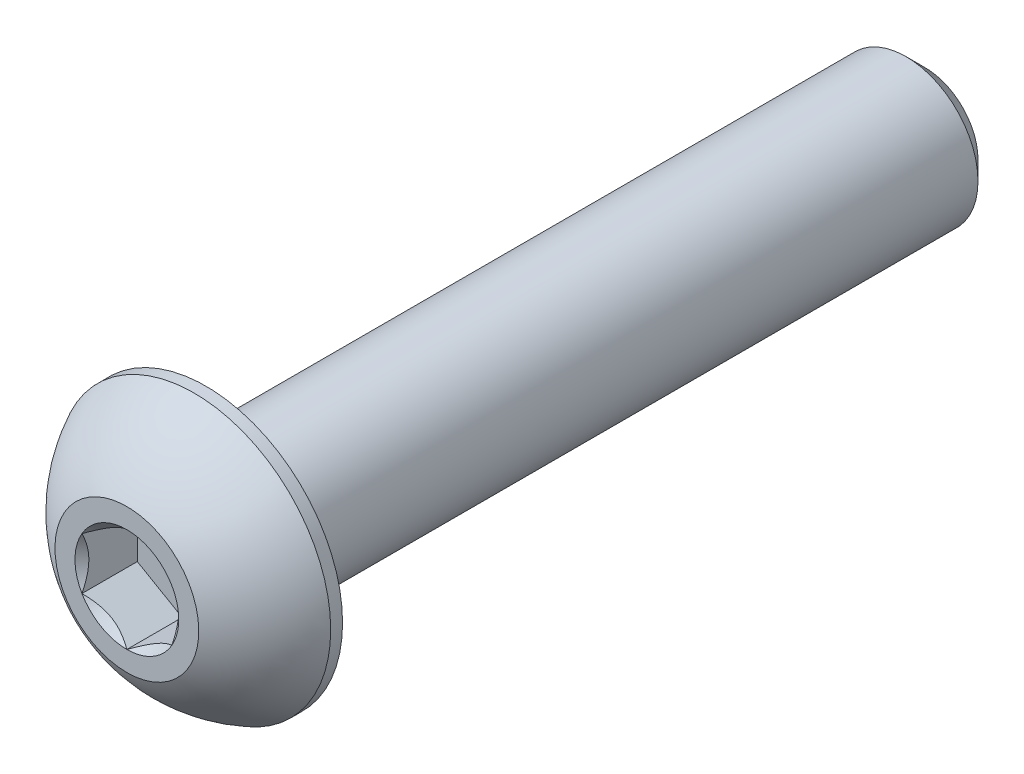
ISO-10303-21;
HEADER;
FILE_DESCRIPTION(('STEP AP214'),'2;1');
FILE_NAME('part.step','',(''),(''),'','','');
FILE_SCHEMA(('AUTOMOTIVE_DESIGN { 1 0 10303 214 1 1 1 1 }'));
ENDSEC;
DATA;
#1=APPLICATION_CONTEXT('core data for automotive mechanical design processes');
#2=APPLICATION_PROTOCOL_DEFINITION('international standard','automotive_design',2000,#1);
#3=PRODUCT_CONTEXT('',#1,'mechanical');
#4=PRODUCT('Part','Part','',(#3));
#5=PRODUCT_RELATED_PRODUCT_CATEGORY('part','',(#4));
#6=PRODUCT_DEFINITION_FORMATION('','',#4);
#7=PRODUCT_DEFINITION_CONTEXT('part definition',#1,'design');
#8=PRODUCT_DEFINITION('design','',#6,#7);
#9=PRODUCT_DEFINITION_SHAPE('','',#8);
#10=(LENGTH_UNIT() NAMED_UNIT(*) SI_UNIT(.MILLI.,.METRE.));
#11=(NAMED_UNIT(*) PLANE_ANGLE_UNIT() SI_UNIT($,.RADIAN.));
#12=(NAMED_UNIT(*) SI_UNIT($,.STERADIAN.) SOLID_ANGLE_UNIT());
#13=UNCERTAINTY_MEASURE_WITH_UNIT(LENGTH_MEASURE(1.E-05),#10,'distance_accuracy_value','');
#14=(GEOMETRIC_REPRESENTATION_CONTEXT(3) GLOBAL_UNCERTAINTY_ASSIGNED_CONTEXT((#13)) GLOBAL_UNIT_ASSIGNED_CONTEXT((#10,
#11,#12)) REPRESENTATION_CONTEXT('',''));
#15=CARTESIAN_POINT('',(0.,0.,0.));
#16=DIRECTION('',(0.,0.,1.));
#17=DIRECTION('',(1.,0.,0.));
#18=AXIS2_PLACEMENT_3D('',#15,#16,#17);
#19=CARTESIAN_POINT('',(0.,0.,-22.2));
#20=DIRECTION('',(0.,0.,1.));
#21=DIRECTION('',(1.,0.,0.));
#22=AXIS2_PLACEMENT_3D('',#19,#20,#21);
#23=PLANE('',#22);
#24=CARTESIAN_POINT('',(0.,0.,-22.2));
#25=DIRECTION('',(0.,0.,1.));
#26=DIRECTION('',(1.,0.,0.));
#27=AXIS2_PLACEMENT_3D('',#24,#25,#26);
#28=CIRCLE('',#27,1.47500000000003);
#29=CARTESIAN_POINT('',(1.47500000000003,0.,-22.2));
#30=VERTEX_POINT('',#29);
#31=EDGE_CURVE('E55',#30,#30,#28,.T.);
#32=ORIENTED_EDGE('',*,*,#31,.F.);
#33=EDGE_LOOP('',(#32));
#34=FACE_BOUND('',#33,.T.);
#35=ADVANCED_FACE('F41',(#34),#23,.F.);
#36=CARTESIAN_POINT('',(0.,0.,-22.2));
#37=DIRECTION('',(0.,0.,1.));
#38=DIRECTION('',(1.,0.,0.));
#39=AXIS2_PLACEMENT_3D('',#36,#37,#38);
#40=CONICAL_SURFACE('',#39,1.47500000000003,0.785398163397436);
#41=CARTESIAN_POINT('',(0.,0.,-21.675));
#42=DIRECTION('',(0.,0.,1.));
#43=DIRECTION('',(1.,0.,0.));
#44=AXIS2_PLACEMENT_3D('',#41,#42,#43);
#45=CIRCLE('',#44,2.00000000000001);
#46=CARTESIAN_POINT('',(2.00000000000001,0.,-21.675));
#47=VERTEX_POINT('',#46);
#48=EDGE_CURVE('E198',#47,#47,#45,.T.);
#49=ORIENTED_EDGE('',*,*,#48,.F.);
#50=EDGE_LOOP('',(#49));
#51=FACE_BOUND('',#50,.T.);
#52=ORIENTED_EDGE('',*,*,#31,.T.);
#53=EDGE_LOOP('',(#52));
#54=FACE_BOUND('',#53,.T.);
#55=ADVANCED_FACE('F205',(#51,#54),#40,.T.);
#56=CARTESIAN_POINT('',(0.,0.,0.));
#57=DIRECTION('',(0.,0.,1.));
#58=DIRECTION('',(1.,0.,0.));
#59=AXIS2_PLACEMENT_3D('',#56,#57,#58);
#60=CYLINDRICAL_SURFACE('',#59,2.00000000000001);
#61=CARTESIAN_POINT('',(0.,0.,-2.2));
#62=DIRECTION('',(0.,0.,1.));
#63=DIRECTION('',(1.,0.,0.));
#64=AXIS2_PLACEMENT_3D('',#61,#62,#63);
#65=CIRCLE('',#64,2.00000000000001);
#66=CARTESIAN_POINT('',(2.00000000000001,0.,-2.2));
#67=VERTEX_POINT('',#66);
#68=EDGE_CURVE('E194',#67,#67,#65,.T.);
#69=ORIENTED_EDGE('',*,*,#68,.F.);
#70=EDGE_LOOP('',(#69));
#71=FACE_BOUND('',#70,.T.);
#72=ORIENTED_EDGE('',*,*,#48,.T.);
#73=EDGE_LOOP('',(#72));
#74=FACE_BOUND('',#73,.T.);
#75=ADVANCED_FACE('F211',(#71,#74),#60,.T.);
#76=CARTESIAN_POINT('',(0.,-3.8,-2.2));
#77=DIRECTION('',(0.,0.,1.));
#78=DIRECTION('',(1.,0.,0.));
#79=AXIS2_PLACEMENT_3D('',#76,#77,#78);
#80=PLANE('',#79);
#81=CARTESIAN_POINT('',(0.,0.,-2.2));
#82=DIRECTION('',(0.,0.,1.));
#83=DIRECTION('',(1.,0.,0.));
#84=AXIS2_PLACEMENT_3D('',#81,#82,#83);
#85=CIRCLE('',#84,3.8);
#86=CARTESIAN_POINT('',(3.8,0.,-2.2));
#87=VERTEX_POINT('',#86);
#88=EDGE_CURVE('E186',#87,#87,#85,.T.);
#89=ORIENTED_EDGE('',*,*,#88,.F.);
#90=EDGE_LOOP('',(#89));
#91=FACE_BOUND('',#90,.T.);
#92=ORIENTED_EDGE('',*,*,#68,.T.);
#93=EDGE_LOOP('',(#92));
#94=FACE_BOUND('',#93,.T.);
#95=ADVANCED_FACE('F216',(#91,#94),#80,.F.);
#96=CARTESIAN_POINT('',(0.,0.,-3.72644385026738));
#97=DIRECTION('',(0.,0.,1.));
#98=DIRECTION('',(0.,-1.,0.));
#99=AXIS2_PLACEMENT_3D('',#96,#97,#98);
#100=SPHERICAL_SURFACE('',#99,4.22922968981299);
#101=CARTESIAN_POINT('',(0.,0.,0.));
#102=DIRECTION('',(0.,0.,1.));
#103=DIRECTION('',(1.,0.,0.));
#104=AXIS2_PLACEMENT_3D('',#101,#102,#103);
#105=CIRCLE('',#104,2.00000000000001);
#106=CARTESIAN_POINT('',(0.,-2.00000000000001,0.));
#107=VERTEX_POINT('',#106);
#108=EDGE_CURVE('E190',#107,#107,#105,.T.);
#109=CARTESIAN_POINT('',(0.,0.,-1.87));
#110=DIRECTION('',(0.,0.,1.));
#111=DIRECTION('',(1.,0.,0.));
#112=AXIS2_PLACEMENT_3D('',#109,#110,#111);
#113=CIRCLE('',#112,3.8);
#114=CARTESIAN_POINT('',(0.,-3.8,-1.87));
#115=VERTEX_POINT('',#114);
#116=EDGE_CURVE('E182',#115,#115,#113,.T.);
#117=CARTESIAN_POINT('',(0.,-2.00000000000001,0.));
#118=CARTESIAN_POINT('',(0.,-2.02421343985615,-0.0129954259644869));
#119=CARTESIAN_POINT('',(0.,-2.04830018323976,-0.0262269129651298));
#120=CARTESIAN_POINT('',(0.,-2.09621120342127,-0.0531568415057489));
#121=CARTESIAN_POINT('',(0.,-2.12003548021918,-0.0668552830457251));
#122=CARTESIAN_POINT('',(0.,-2.16741249358868,-0.0947139531320313));
#123=CARTESIAN_POINT('',(0.,-2.19096523016027,-0.108874181678362));
#124=CARTESIAN_POINT('',(0.,-2.23779021933684,-0.137651035235957));
#125=CARTESIAN_POINT('',(0.,-2.26106247194182,-0.152267660247222));
#126=CARTESIAN_POINT('',(0.,-2.30731764886073,-0.181951755514141));
#127=CARTESIAN_POINT('',(0.,-2.33030057317466,-0.197019225769796));
#128=CARTESIAN_POINT('',(0.,-2.37596836104236,-0.227599285582871));
#129=CARTESIAN_POINT('',(0.,-2.39865322459613,-0.243111875140292));
#130=CARTESIAN_POINT('',(0.,-2.44371627121514,-0.274576279395883));
#131=CARTESIAN_POINT('',(0.,-2.46609445428039,-0.290528094094054));
#132=CARTESIAN_POINT('',(0.,-2.51053563686182,-0.322864887331673));
#133=CARTESIAN_POINT('',(0.,-2.53259863637801,-0.339249865871121));
#134=CARTESIAN_POINT('',(0.,-2.57640106852493,-0.372446760967232));
#135=CARTESIAN_POINT('',(0.,-2.59814050115565,-0.389258677523893));
#136=CARTESIAN_POINT('',(0.,-2.64128753915154,-0.423303060588149));
#137=CARTESIAN_POINT('',(0.,-2.66269514451672,-0.440535527095743));
#138=CARTESIAN_POINT('',(0.,-2.70517039368396,-0.475414462202968));
#139=CARTESIAN_POINT('',(0.,-2.72623803748603,-0.493060930802598));
#140=CARTESIAN_POINT('',(0.,-2.76802535840619,-0.52876116492441));
#141=CARTESIAN_POINT('',(0.,-2.78874503552429,-0.546814930446591));
#142=CARTESIAN_POINT('',(0.,-2.82982855017314,-0.583322898482808));
#143=CARTESIAN_POINT('',(0.,-2.8501923877039,-0.601777100996845));
#144=CARTESIAN_POINT('',(0.,-2.89055648548395,-0.639078930931024));
#145=CARTESIAN_POINT('',(0.,-2.91055674573325,-0.657926558351167));
#146=CARTESIAN_POINT('',(0.,-2.95018608940553,-0.696008076521268));
#147=CARTESIAN_POINT('',(0.,-2.96981517282853,-0.715241967271226));
#148=CARTESIAN_POINT('',(0.,-3.00869470434028,-0.754088703755296));
#149=CARTESIAN_POINT('',(0.,-3.02794515242904,-0.773701549489407));
#150=CARTESIAN_POINT('',(0.,-3.06606009863533,-0.813298743603727));
#151=CARTESIAN_POINT('',(0.,-3.08492459675287,-0.833283091983936));
#152=CARTESIAN_POINT('',(0.,-3.12226047503003,-0.873615697891679));
#153=CARTESIAN_POINT('',(0.,-3.14073185518965,-0.893963955419214));
#154=CARTESIAN_POINT('',(0.,-3.17727447893822,-0.935016647847444));
#155=CARTESIAN_POINT('',(0.,-3.19534572252716,-0.95572108274814));
#156=CARTESIAN_POINT('',(0.,-3.23108120656243,-0.99747826281099));
#157=CARTESIAN_POINT('',(0.,-3.24874544700875,-1.01853100797314));
#158=CARTESIAN_POINT('',(0.,-3.28366021283673,-1.06097680909897));
#159=CARTESIAN_POINT('',(0.,-3.30091073821839,-1.08236986506264));
#160=CARTESIAN_POINT('',(0.,-3.33499151919534,-1.12548815902284));
#161=CARTESIAN_POINT('',(0.,-3.35182177479064,-1.14721339701936));
#162=CARTESIAN_POINT('',(0.,-3.38505562116372,-1.1909878000568));
#163=CARTESIAN_POINT('',(0.,-3.40145921194149,-1.21303696509771));
#164=CARTESIAN_POINT('',(0.,-3.43383349577047,-1.25745084415152));
#165=CARTESIAN_POINT('',(0.,-3.44980418882167,-1.27981555816441));
#166=CARTESIAN_POINT('',(0.,-3.48130660877275,-1.32485203719233));
#167=CARTESIAN_POINT('',(0.,-3.49683833567264,-1.34752380220736));
#168=CARTESIAN_POINT('',(0.,-3.52745692170932,-1.39316576858967));
#169=CARTESIAN_POINT('',(0.,-3.5425437808461,-1.41613596995695));
#170=CARTESIAN_POINT('',(0.,-3.57226689871518,-1.46236608103065));
#171=CARTESIAN_POINT('',(0.,-3.58690315744748,-1.48562599073709));
#172=CARTESIAN_POINT('',(0.,-3.615719513332,-1.5324266802666));
#173=CARTESIAN_POINT('',(0.,-3.62989961048422,-1.55596746008967));
#174=CARTESIAN_POINT('',(0.,-3.65779825442823,-1.6033209453859));
#175=CARTESIAN_POINT('',(0.,-3.67151680122002,-1.62713365085906));
#176=CARTESIAN_POINT('',(0.,-3.69848713452322,-1.67502193787766));
#177=CARTESIAN_POINT('',(0.,-3.71173892103461,-1.6990975194231));
#178=CARTESIAN_POINT('',(0.,-3.73777068821038,-1.74750241579215));
#179=CARTESIAN_POINT('',(0.,-3.75055066887474,-1.77183173061575));
#180=CARTESIAN_POINT('',(0.,-3.77563400658953,-1.82073482944519));
#181=CARTESIAN_POINT('',(0.,-3.78793736363997,-1.84530861345103));
#182=CARTESIAN_POINT('',(0.,-3.8,-1.87));
#183=B_SPLINE_CURVE_WITH_KNOTS('',3,(#117,#118,#119,#120,#121,#122,#123,#124,#125,#126,#127,
#128,#129,#130,#131,#132,#133,#134,#135,#136,#137,#138,#139,#140,#141,#142,#143,#144,#145,#146,
#147,#148,#149,#150,#151,#152,#153,#154,#155,#156,#157,#158,#159,#160,#161,#162,#163,#164,#165,
#166,#167,#168,#169,#170,#171,#172,#173,#174,#175,#176,#177,#178,#179,#180,#181,#182),
.UNSPECIFIED.,.F.,.F.,(4,2,2,2,2,2,2,2,2,2,2,2,2,2,2,2,2,2,2,2,2,2,2,2,2,2,2,2,2,2,2,2,4),(0.,
0.0824398589102638,0.164879717820528,0.247319576730792,0.329759435641056,0.41219929455132,
0.494639153461583,0.577079012371847,0.659518871282112,0.741958730192376,0.82439858910264,
0.906838448012904,0.989278306923168,1.07171816583343,1.1541580247437,1.23659788365396,
1.31903774256422,1.40147760147449,1.48391746038475,1.56635731929502,1.64879717820528,
1.73123703711554,1.81367689602581,1.89611675493607,1.97855661384634,2.0609964727566,
2.14343633166686,2.22587619057713,2.30831604948739,2.39075590839766,2.47319576730792,
2.55563562621818,2.63807548512845),.UNSPECIFIED.);
#184=EDGE_CURVE('BSEAM221',#107,#115,#183,.T.);
#185=ORIENTED_EDGE('',*,*,#108,.F.);
#186=ORIENTED_EDGE('',*,*,#116,.T.);
#187=ORIENTED_EDGE('',*,*,#184,.T.);
#188=ORIENTED_EDGE('',*,*,#184,.F.);
#189=EDGE_LOOP('',(#185,#187,#186,#188));
#190=FACE_BOUND('',#189,.T.);
#191=ADVANCED_FACE('F221',(#190),#100,.T.);
#192=CARTESIAN_POINT('',(0.,-2.00000000000001,0.));
#193=DIRECTION('',(0.,0.,-1.));
#194=DIRECTION('',(-1.,0.,0.));
#195=AXIS2_PLACEMENT_3D('',#192,#193,#194);
#196=PLANE('',#195);
#197=CARTESIAN_POINT('',(0.,0.,0.));
#198=DIRECTION('',(0.,0.,1.));
#199=DIRECTION('',(1.,0.,0.));
#200=AXIS2_PLACEMENT_3D('',#197,#198,#199);
#201=CIRCLE('',#200,1.44337567297406);
#202=CARTESIAN_POINT('',(-1.25,0.721687836487031,0.));
#203=VERTEX_POINT('',#202);
#204=CARTESIAN_POINT('',(-1.25,-0.721687836487033,0.));
#205=VERTEX_POINT('',#204);
#206=EDGE_CURVE('E68',#203,#205,#201,.T.);
#207=ORIENTED_EDGE('',*,*,#206,.F.);
#208=CARTESIAN_POINT('',(0.,1.44337567297406,0.));
#209=VERTEX_POINT('',#208);
#210=EDGE_CURVE('E145',#209,#203,#201,.T.);
#211=ORIENTED_EDGE('',*,*,#210,.F.);
#212=CARTESIAN_POINT('',(1.25,0.721687836487029,0.));
#213=VERTEX_POINT('',#212);
#214=EDGE_CURVE('E140',#213,#209,#201,.T.);
#215=ORIENTED_EDGE('',*,*,#214,.F.);
#216=CARTESIAN_POINT('',(1.25,-0.721687836487029,0.));
#217=VERTEX_POINT('',#216);
#218=EDGE_CURVE('E109',#217,#213,#201,.T.);
#219=ORIENTED_EDGE('',*,*,#218,.F.);
#220=CARTESIAN_POINT('',(0.,-1.44337567297406,0.));
#221=VERTEX_POINT('',#220);
#222=EDGE_CURVE('E100',#221,#217,#201,.T.);
#223=ORIENTED_EDGE('',*,*,#222,.F.);
#224=EDGE_CURVE('E61',#205,#221,#201,.T.);
#225=ORIENTED_EDGE('',*,*,#224,.F.);
#226=EDGE_LOOP('',(#207,#211,#215,#219,#223,#225));
#227=FACE_BOUND('',#226,.T.);
#228=ORIENTED_EDGE('',*,*,#108,.T.);
#229=EDGE_LOOP('',(#228));
#230=FACE_BOUND('',#229,.T.);
#231=ADVANCED_FACE('F137',(#227,#230),#196,.F.);
#232=CARTESIAN_POINT('',(0.,0.,0.));
#233=DIRECTION('',(0.,0.,1.));
#234=DIRECTION('',(1.,0.,0.));
#235=AXIS2_PLACEMENT_3D('',#232,#233,#234);
#236=CYLINDRICAL_SURFACE('',#235,3.8);
#237=ORIENTED_EDGE('',*,*,#116,.F.);
#238=EDGE_LOOP('',(#237));
#239=FACE_BOUND('',#238,.T.);
#240=ORIENTED_EDGE('',*,*,#88,.T.);
#241=EDGE_LOOP('',(#240));
#242=FACE_BOUND('',#241,.T.);
#243=ADVANCED_FACE('F227',(#239,#242),#236,.T.);
#244=CARTESIAN_POINT('',(0.,0.,0.));
#245=DIRECTION('',(0.,0.,1.));
#246=DIRECTION('',(1.,0.,0.));
#247=AXIS2_PLACEMENT_3D('',#244,#245,#246);
#248=CONICAL_SURFACE('',#247,1.44337567297406,0.78539816339745);
#249=ORIENTED_EDGE('',*,*,#218,.T.);
#250=CARTESIAN_POINT('',(1.25,-1.43934010808076,0.462982096892323));
#251=CARTESIAN_POINT('',(1.25,-1.40429313005658,0.436524922632886));
#252=CARTESIAN_POINT('',(1.25,-1.36905087135598,0.410327160354276));
#253=CARTESIAN_POINT('',(1.25,-1.2980965070631,0.358557571839581));
#254=CARTESIAN_POINT('',(1.25,-1.26238428576495,0.332985904356291));
#255=CARTESIAN_POINT('',(1.25,-1.15390111792707,0.257005993689462));
#256=CARTESIAN_POINT('',(1.25,-1.08031646726264,0.207740286189565));
#257=CARTESIAN_POINT('',(1.25,-0.926012322755091,0.111025830263131));
#258=CARTESIAN_POINT('',(1.25,-0.845125318656143,0.0638412989417957));
#259=CARTESIAN_POINT('',(1.25,-0.679311174076599,-0.0224692656095865));
#260=CARTESIAN_POINT('',(1.25,-0.594398891026685,-0.0616224653730992));
#261=CARTESIAN_POINT('',(1.25,-0.466944812460738,-0.109522776311707));
#262=CARTESIAN_POINT('',(1.25,-0.426289985812819,-0.123270510213663));
#263=CARTESIAN_POINT('',(1.25,-0.343998850091265,-0.147502072549456));
#264=CARTESIAN_POINT('',(1.25,-0.30236247361496,-0.157985676130227));
#265=CARTESIAN_POINT('',(1.25,-0.219052696285663,-0.174969838251702));
#266=CARTESIAN_POINT('',(1.25,-0.177393428474498,-0.18153863952863));
#267=CARTESIAN_POINT('',(1.25,-0.0936293693401902,-0.190564946542239));
#268=CARTESIAN_POINT('',(1.25,-0.0515246558543941,-0.193023159002731));
#269=CARTESIAN_POINT('',(1.25,0.0311890576306333,-0.193645937986714));
#270=CARTESIAN_POINT('',(1.25,0.071796962549932,-0.191962883153752));
#271=CARTESIAN_POINT('',(1.25,0.152668636885198,-0.184731729402085));
#272=CARTESIAN_POINT('',(1.25,0.192932338835359,-0.179182889586891));
#273=CARTESIAN_POINT('',(1.25,0.273499879165296,-0.164428963535045));
#274=CARTESIAN_POINT('',(1.25,0.313792180618512,-0.155161824035893));
#275=CARTESIAN_POINT('',(1.25,0.393496413911458,-0.133463821542651));
#276=CARTESIAN_POINT('',(1.25,0.43290841911506,-0.121033223269353));
#277=CARTESIAN_POINT('',(1.25,0.556992735862299,-0.0772206470685609));
#278=CARTESIAN_POINT('',(1.25,0.639898924666086,-0.0408489271240422));
#279=CARTESIAN_POINT('',(1.25,0.801816555499702,0.0400191621783368));
#280=CARTESIAN_POINT('',(1.25,0.880812666325045,0.084544720911988));
#281=CARTESIAN_POINT('',(1.25,1.0317856127975,0.176404876666627));
#282=CARTESIAN_POINT('',(1.25,1.10391618485086,0.223489933916251));
#283=CARTESIAN_POINT('',(1.25,1.21018606043311,0.29627856159854));
#284=CARTESIAN_POINT('',(1.25,1.24515069969379,0.32079808539336));
#285=CARTESIAN_POINT('',(1.25,1.31460220852737,0.370485636765682));
#286=CARTESIAN_POINT('',(1.25,1.34908920596618,0.395653485415522));
#287=CARTESIAN_POINT('',(1.25,1.38337731682912,0.421090148841215));
#288=B_SPLINE_CURVE_WITH_KNOTS('',3,(#250,#251,#252,#253,#254,#255,#256,#257,#258,#259,#260,
#261,#262,#263,#264,#265,#266,#267,#268,#269,#270,#271,#272,#273,#274,#275,#276,#277,#278,#279,
#280,#281,#282,#283,#284,#285,#286,#287),.UNSPECIFIED.,.F.,.F.,(4,2,2,2,2,2,2,2,2,2,2,2,2,2,2,2,
2,2,4),(0.,0.131732960381447,0.263498984161643,0.529042014455823,0.809741926134614,
1.08947609717225,1.21811634272576,1.346765447839,1.47310084517843,1.59941451973784,
1.72115042167849,1.84290966131734,1.96679153905341,2.09066305366038,2.36146692896008,
2.6332598919849,2.89154668212278,3.01965734507712,3.14773302245627),.UNSPECIFIED.);
#289=EDGE_CURVE('E11',#217,#213,#288,.T.);
#290=ORIENTED_EDGE('',*,*,#289,.F.);
#291=EDGE_LOOP('',(#249,#290));
#292=FACE_BOUND('',#291,.T.);
#293=ADVANCED_FACE('F113',(#292),#248,.F.);
#294=ORIENTED_EDGE('',*,*,#214,.T.);
#295=CARTESIAN_POINT('',(1.2502,0.721572366433193,0.000115483909137106));
#296=CARTESIAN_POINT('',(1.20722483292841,0.746384090710443,-0.0246783319448953));
#297=CARTESIAN_POINT('',(1.16353099525405,0.771610739653663,-0.0480162655813155));
#298=CARTESIAN_POINT('',(1.07443406915806,0.823050873919154,-0.0907479959154626));
#299=CARTESIAN_POINT('',(1.02902250164294,0.849269254648332,-0.110118007639585));
#300=CARTESIAN_POINT('',(0.93745217906474,0.902137405038635,-0.143299516586522));
#301=CARTESIAN_POINT('',(0.891316759824114,0.928773701756386,-0.157194440947344));
#302=CARTESIAN_POINT('',(0.798029919592407,0.982632884076012,-0.178602717839361));
#303=CARTESIAN_POINT('',(0.75088135086362,1.00985412292348,-0.186132058433213));
#304=CARTESIAN_POINT('',(0.669626443112747,1.05676666578643,-0.192925501949297));
#305=CARTESIAN_POINT('',(0.635625123372058,1.07639733689152,-0.19393144089565));
#306=CARTESIAN_POINT('',(0.567682235567522,1.11562418145499,-0.192238585088681));
#307=CARTESIAN_POINT('',(0.533740682344342,1.1352203463451,-0.189538972784461));
#308=CARTESIAN_POINT('',(0.4661851435425,1.1742235548576,-0.180591069683622));
#309=CARTESIAN_POINT('',(0.432571492713225,1.19363040521232,-0.174339474100294));
#310=CARTESIAN_POINT('',(0.365905361782186,1.23212011385119,-0.158624318586096));
#311=CARTESIAN_POINT('',(0.332853128969704,1.2512028293628,-0.149159379912542));
#312=CARTESIAN_POINT('',(0.248200308399735,1.30007715810653,-0.121068609312414));
#313=CARTESIAN_POINT('',(0.197133507570362,1.32956058931202,-0.100329842547799));
#314=CARTESIAN_POINT('',(0.0969991458867455,1.38737318998519,-0.0536128653285237));
#315=CARTESIAN_POINT('',(0.0479256884217311,1.41570576386268,-0.0276517040532341));
#316=CARTESIAN_POINT('',(-0.000199999999999383,1.4434911430279,0.000115483909135572));
#317=B_SPLINE_CURVE_WITH_KNOTS('',3,(#295,#296,#297,#298,#299,#300,#301,#302,#303,#304,#305,
#306,#307,#308,#309,#310,#311,#312,#313,#314,#315,#316),.UNSPECIFIED.,.F.,.F.,(4,2,2,2,2,2,2,2,
2,2,4),(0.,0.166533409618304,0.334037607289762,0.498880396489699,0.663307919240276,
0.780963963458828,0.898645970148454,1.01643764860773,1.1342799317155,1.32148652032141,
1.50809158792573),.UNSPECIFIED.);
#318=EDGE_CURVE('E144',#213,#209,#317,.T.);
#319=ORIENTED_EDGE('',*,*,#318,.F.);
#320=EDGE_LOOP('',(#294,#319));
#321=FACE_BOUND('',#320,.T.);
#322=ADVANCED_FACE('F323',(#321),#248,.F.);
#323=ORIENTED_EDGE('',*,*,#210,.T.);
#324=CARTESIAN_POINT('',(0.000200000000000433,1.4434911430279,0.000115483909135892));
#325=CARTESIAN_POINT('',(-0.0427751670715862,1.41867941875065,-0.0246783319448965));
#326=CARTESIAN_POINT('',(-0.0864690047459474,1.39345276980743,-0.0480162655813166));
#327=CARTESIAN_POINT('',(-0.175565930841941,1.34201263554194,-0.0907479959154634));
#328=CARTESIAN_POINT('',(-0.220977498357063,1.31579425481276,-0.110118007639586));
#329=CARTESIAN_POINT('',(-0.312547820935259,1.26292610442246,-0.143299516586523));
#330=CARTESIAN_POINT('',(-0.358683240175885,1.23628980770471,-0.157194440947344));
#331=CARTESIAN_POINT('',(-0.451970080407591,1.18243062538508,-0.178602717839361));
#332=CARTESIAN_POINT('',(-0.499118649136379,1.15520938653761,-0.186132058433213));
#333=CARTESIAN_POINT('',(-0.580373556887251,1.10829684367467,-0.192925501949298));
#334=CARTESIAN_POINT('',(-0.61437487662794,1.08866617256958,-0.193931440895651));
#335=CARTESIAN_POINT('',(-0.682317764432476,1.04943932800611,-0.192238585088682));
#336=CARTESIAN_POINT('',(-0.716259317655656,1.02984316311599,-0.189538972784462));
#337=CARTESIAN_POINT('',(-0.783814856457498,0.990839954603498,-0.180591069683623));
#338=CARTESIAN_POINT('',(-0.817428507286774,0.97143310424877,-0.174339474100295));
#339=CARTESIAN_POINT('',(-0.884094638217812,0.932943395609904,-0.158624318586097));
#340=CARTESIAN_POINT('',(-0.917146871030294,0.913860680098299,-0.149159379912542));
#341=CARTESIAN_POINT('',(-1.00179969160026,0.864986351354567,-0.121068609312415));
#342=CARTESIAN_POINT('',(-1.05286649242964,0.835502920149075,-0.1003298425478));
#343=CARTESIAN_POINT('',(-1.15300085411325,0.777690319475907,-0.0536128653285245));
#344=CARTESIAN_POINT('',(-1.20207431157827,0.749357745598416,-0.0276517040532348));
#345=CARTESIAN_POINT('',(-1.2502,0.721572366433194,0.000115483909135054));
#346=B_SPLINE_CURVE_WITH_KNOTS('',3,(#324,#325,#326,#327,#328,#329,#330,#331,#332,#333,#334,
#335,#336,#337,#338,#339,#340,#341,#342,#343,#344,#345),.UNSPECIFIED.,.F.,.F.,(4,2,2,2,2,2,2,2,
2,2,4),(0.,0.166533409618303,0.334037607289761,0.498880396489697,0.663307919240274,
0.780963963458826,0.898645970148452,1.01643764860773,1.13427993171549,1.32148652032141,
1.50809158792573),.UNSPECIFIED.);
#347=EDGE_CURVE('E151',#209,#203,#346,.T.);
#348=ORIENTED_EDGE('',*,*,#347,.F.);
#349=EDGE_LOOP('',(#323,#348));
#350=FACE_BOUND('',#349,.T.);
#351=ADVANCED_FACE('F156',(#350),#248,.F.);
#352=ORIENTED_EDGE('',*,*,#206,.T.);
#353=CARTESIAN_POINT('',(-1.25,-1.43934010808077,0.462982096892325));
#354=CARTESIAN_POINT('',(-1.25,-1.40429313005658,0.436524922632887));
#355=CARTESIAN_POINT('',(-1.25,-1.36905087135599,0.410327160354277));
#356=CARTESIAN_POINT('',(-1.25,-1.29809650706311,0.358557571839583));
#357=CARTESIAN_POINT('',(-1.25,-1.26238428576495,0.332985904356292));
#358=CARTESIAN_POINT('',(-1.25,-1.15390111792708,0.257005993689462));
#359=CARTESIAN_POINT('',(-1.25,-1.08031646726264,0.207740286189565));
#360=CARTESIAN_POINT('',(-1.25,-0.926012322755094,0.11102583026313));
#361=CARTESIAN_POINT('',(-1.25,-0.845125318656146,0.0638412989417953));
#362=CARTESIAN_POINT('',(-1.25,-0.679311174076601,-0.0224692656095875));
#363=CARTESIAN_POINT('',(-1.25,-0.594398891026687,-0.0616224653731005));
#364=CARTESIAN_POINT('',(-1.25,-0.46694481246074,-0.109522776311709));
#365=CARTESIAN_POINT('',(-1.25,-0.426289985812821,-0.123270510213665));
#366=CARTESIAN_POINT('',(-1.25,-0.343998850091267,-0.147502072549458));
#367=CARTESIAN_POINT('',(-1.25,-0.302362473614962,-0.157985676130229));
#368=CARTESIAN_POINT('',(-1.25,-0.219052696285665,-0.174969838251704));
#369=CARTESIAN_POINT('',(-1.25,-0.1773934284745,-0.181538639528632));
#370=CARTESIAN_POINT('',(-1.25,-0.0936293693401922,-0.190564946542242));
#371=CARTESIAN_POINT('',(-1.25,-0.051524655854396,-0.193023159002733));
#372=CARTESIAN_POINT('',(-1.25,0.0311890576306315,-0.193645937986716));
#373=CARTESIAN_POINT('',(-1.25,0.0717969625499304,-0.191962883153754));
#374=CARTESIAN_POINT('',(-1.25,0.152668636885197,-0.184731729402088));
#375=CARTESIAN_POINT('',(-1.25,0.192932338835358,-0.179182889586893));
#376=CARTESIAN_POINT('',(-1.25,0.273499879165295,-0.164428963535048));
#377=CARTESIAN_POINT('',(-1.25,0.313792180618511,-0.155161824035896));
#378=CARTESIAN_POINT('',(-1.25,0.393496413911457,-0.133463821542654));
#379=CARTESIAN_POINT('',(-1.25,0.432908419115058,-0.121033223269356));
#380=CARTESIAN_POINT('',(-1.25,0.556992735862297,-0.0772206470685636));
#381=CARTESIAN_POINT('',(-1.25,0.639898924666085,-0.0408489271240449));
#382=CARTESIAN_POINT('',(-1.25,0.8018165554997,0.040019162178334));
#383=CARTESIAN_POINT('',(-1.25,0.880812666325043,0.084544720911985));
#384=CARTESIAN_POINT('',(-1.25,1.0317856127975,0.176404876666624));
#385=CARTESIAN_POINT('',(-1.25,1.10391618485086,0.223489933916248));
#386=CARTESIAN_POINT('',(-1.25,1.2101860604331,0.296278561598537));
#387=CARTESIAN_POINT('',(-1.25,1.24515069969379,0.320798085393357));
#388=CARTESIAN_POINT('',(-1.25,1.31460220852736,0.370485636765679));
#389=CARTESIAN_POINT('',(-1.25,1.34908920596618,0.395653485415518));
#390=CARTESIAN_POINT('',(-1.25,1.38337731682911,0.421090148841212));
#391=B_SPLINE_CURVE_WITH_KNOTS('',3,(#353,#354,#355,#356,#357,#358,#359,#360,#361,#362,#363,
#364,#365,#366,#367,#368,#369,#370,#371,#372,#373,#374,#375,#376,#377,#378,#379,#380,#381,#382,
#383,#384,#385,#386,#387,#388,#389,#390),.UNSPECIFIED.,.F.,.F.,(4,2,2,2,2,2,2,2,2,2,2,2,2,2,2,2,
2,2,4),(0.,0.131732960381448,0.263498984161644,0.529042014455824,0.809741926134617,
1.08947609717225,1.21811634272576,1.346765447839,1.47310084517844,1.59941451973784,
1.72115042167849,1.84290966131735,1.96679153905341,2.09066305366039,2.36146692896009,
2.63325989198491,2.89154668212279,3.01965734507712,3.14773302245628),.UNSPECIFIED.);
#392=EDGE_CURVE('E161',#203,#205,#391,.F.);
#393=ORIENTED_EDGE('',*,*,#392,.F.);
#394=EDGE_LOOP('',(#352,#393));
#395=FACE_BOUND('',#394,.T.);
#396=ADVANCED_FACE('F317',(#395),#248,.F.);
#397=ORIENTED_EDGE('',*,*,#224,.T.);
#398=CARTESIAN_POINT('',(-1.2502,-0.721572366433194,0.000115483909134937));
#399=CARTESIAN_POINT('',(-1.20722483292841,-0.746384090710444,-0.0246783319448973));
#400=CARTESIAN_POINT('',(-1.16353099525405,-0.771610739653664,-0.0480162655813174));
#401=CARTESIAN_POINT('',(-1.07443406915806,-0.823050873919154,-0.0907479959154642));
#402=CARTESIAN_POINT('',(-1.02902250164293,-0.849269254648332,-0.110118007639587));
#403=CARTESIAN_POINT('',(-0.937452179064738,-0.902137405038635,-0.143299516586524));
#404=CARTESIAN_POINT('',(-0.891316759824113,-0.928773701756386,-0.157194440947345));
#405=CARTESIAN_POINT('',(-0.798029919592406,-0.982632884076012,-0.178602717839362));
#406=CARTESIAN_POINT('',(-0.750881350863619,-1.00985412292348,-0.186132058433214));
#407=CARTESIAN_POINT('',(-0.669626443112746,-1.05676666578643,-0.192925501949298));
#408=CARTESIAN_POINT('',(-0.635625123372058,-1.07639733689152,-0.193931440895651));
#409=CARTESIAN_POINT('',(-0.567682235567521,-1.11562418145499,-0.192238585088682));
#410=CARTESIAN_POINT('',(-0.533740682344341,-1.1352203463451,-0.189538972784462));
#411=CARTESIAN_POINT('',(-0.466185143542499,-1.1742235548576,-0.180591069683623));
#412=CARTESIAN_POINT('',(-0.432571492713224,-1.19363040521232,-0.174339474100295));
#413=CARTESIAN_POINT('',(-0.365905361782186,-1.23212011385119,-0.158624318586096));
#414=CARTESIAN_POINT('',(-0.332853128969703,-1.25120282936279,-0.149159379912542));
#415=CARTESIAN_POINT('',(-0.248200308399735,-1.30007715810653,-0.121068609312415));
#416=CARTESIAN_POINT('',(-0.197133507570361,-1.32956058931202,-0.1003298425478));
#417=CARTESIAN_POINT('',(-0.0969991458867451,-1.38737318998519,-0.0536128653285245));
#418=CARTESIAN_POINT('',(-0.0479256884217308,-1.41570576386268,-0.0276517040532348));
#419=CARTESIAN_POINT('',(0.000199999999999627,-1.4434911430279,0.000115483909135029));
#420=B_SPLINE_CURVE_WITH_KNOTS('',3,(#398,#399,#400,#401,#402,#403,#404,#405,#406,#407,#408,
#409,#410,#411,#412,#413,#414,#415,#416,#417,#418,#419),.UNSPECIFIED.,.F.,.F.,(4,2,2,2,2,2,2,2,
2,2,4),(0.,0.166533409618303,0.334037607289761,0.498880396489697,0.663307919240273,
0.780963963458825,0.898645970148451,1.01643764860773,1.13427993171549,1.32148652032141,
1.50809158792573),.UNSPECIFIED.);
#421=EDGE_CURVE('E126',#205,#221,#420,.T.);
#422=ORIENTED_EDGE('',*,*,#421,.F.);
#423=EDGE_LOOP('',(#397,#422));
#424=FACE_BOUND('',#423,.T.);
#425=ADVANCED_FACE('F256',(#424),#248,.F.);
#426=ORIENTED_EDGE('',*,*,#222,.T.);
#427=CARTESIAN_POINT('',(-0.000200000000000326,-1.4434911430279,0.000115483909135025));
#428=CARTESIAN_POINT('',(0.0427751670715863,-1.41867941875065,-0.0246783319448973));
#429=CARTESIAN_POINT('',(0.0864690047459475,-1.39345276980743,-0.0480162655813174));
#430=CARTESIAN_POINT('',(0.175565930841941,-1.34201263554194,-0.0907479959154642));
#431=CARTESIAN_POINT('',(0.220977498357063,-1.31579425481276,-0.110118007639587));
#432=CARTESIAN_POINT('',(0.312547820935259,-1.26292610442246,-0.143299516586524));
#433=CARTESIAN_POINT('',(0.358683240175885,-1.23628980770471,-0.157194440947345));
#434=CARTESIAN_POINT('',(0.451970080407591,-1.18243062538508,-0.178602717839362));
#435=CARTESIAN_POINT('',(0.499118649136378,-1.15520938653761,-0.186132058433214));
#436=CARTESIAN_POINT('',(0.580373556887251,-1.10829684367467,-0.192925501949298));
#437=CARTESIAN_POINT('',(0.614374876627939,-1.08866617256958,-0.193931440895651));
#438=CARTESIAN_POINT('',(0.682317764432476,-1.04943932800611,-0.192238585088682));
#439=CARTESIAN_POINT('',(0.716259317655656,-1.02984316311599,-0.189538972784463));
#440=CARTESIAN_POINT('',(0.783814856457498,-0.990839954603497,-0.180591069683624));
#441=CARTESIAN_POINT('',(0.817428507286773,-0.971433104248769,-0.174339474100296));
#442=CARTESIAN_POINT('',(0.884094638217811,-0.932943395609904,-0.158624318586097));
#443=CARTESIAN_POINT('',(0.917146871030293,-0.913860680098299,-0.149159379912543));
#444=CARTESIAN_POINT('',(1.00179969160026,-0.864986351354566,-0.121068609312415));
#445=CARTESIAN_POINT('',(1.05286649242964,-0.835502920149074,-0.100329842547801));
#446=CARTESIAN_POINT('',(1.15300085411325,-0.777690319475906,-0.0536128653285243));
#447=CARTESIAN_POINT('',(1.20207431157827,-0.749357745598414,-0.0276517040532342));
#448=CARTESIAN_POINT('',(1.2502,-0.721572366433191,0.00011548390913593));
#449=B_SPLINE_CURVE_WITH_KNOTS('',3,(#427,#428,#429,#430,#431,#432,#433,#434,#435,#436,#437,
#438,#439,#440,#441,#442,#443,#444,#445,#446,#447,#448),.UNSPECIFIED.,.F.,.F.,(4,2,2,2,2,2,2,2,
2,2,4),(0.,0.166533409618303,0.334037607289761,0.498880396489697,0.663307919240273,
0.780963963458825,0.898645970148451,1.01643764860773,1.13427993171549,1.32148652032141,
1.50809158792574),.UNSPECIFIED.);
#450=EDGE_CURVE('E104',#221,#217,#449,.T.);
#451=ORIENTED_EDGE('',*,*,#450,.F.);
#452=EDGE_LOOP('',(#426,#451));
#453=FACE_BOUND('',#452,.T.);
#454=ADVANCED_FACE('F102',(#453),#248,.F.);
#455=CARTESIAN_POINT('',(1.25,-0.721687836487029,-1.54));
#456=DIRECTION('',(0.,0.,1.));
#457=DIRECTION('',(1.,0.,0.));
#458=AXIS2_PLACEMENT_3D('',#455,#456,#457);
#459=PLANE('',#458);
#460=DIRECTION('',(0.866025403784438,0.5,0.));
#461=VECTOR('',#460,1.);
#462=CARTESIAN_POINT('',(0.,-1.44337567297406,-1.54));
#463=LINE('',#462,#461);
#464=CARTESIAN_POINT('',(0.,-1.44337567297406,-1.54));
#465=VERTEX_POINT('',#464);
#466=CARTESIAN_POINT('',(1.25,-0.721687836487029,-1.54));
#467=VERTEX_POINT('',#466);
#468=EDGE_CURVE('E125',#465,#467,#463,.T.);
#469=ORIENTED_EDGE('',*,*,#468,.T.);
#470=DIRECTION('',(0.,1.,0.));
#471=VECTOR('',#470,1.);
#472=CARTESIAN_POINT('',(1.25,-0.721687836487029,-1.54));
#473=LINE('',#472,#471);
#474=CARTESIAN_POINT('',(1.25,0.721687836487031,-1.54));
#475=VERTEX_POINT('',#474);
#476=EDGE_CURVE('E130',#467,#475,#473,.T.);
#477=ORIENTED_EDGE('',*,*,#476,.T.);
#478=DIRECTION('',(-0.866025403784439,0.5,0.));
#479=VECTOR('',#478,1.);
#480=CARTESIAN_POINT('',(1.25,0.721687836487031,-1.54));
#481=LINE('',#480,#479);
#482=CARTESIAN_POINT('',(0.,1.44337567297406,-1.54));
#483=VERTEX_POINT('',#482);
#484=EDGE_CURVE('E301',#475,#483,#481,.T.);
#485=ORIENTED_EDGE('',*,*,#484,.T.);
#486=DIRECTION('',(-0.866025403784439,-0.5,0.));
#487=VECTOR('',#486,1.);
#488=CARTESIAN_POINT('',(0.,1.44337567297406,-1.54));
#489=LINE('',#488,#487);
#490=CARTESIAN_POINT('',(-1.25,0.721687836487031,-1.54));
#491=VERTEX_POINT('',#490);
#492=EDGE_CURVE('E170',#483,#491,#489,.T.);
#493=ORIENTED_EDGE('',*,*,#492,.T.);
#494=DIRECTION('',(0.,-1.,0.));
#495=VECTOR('',#494,1.);
#496=CARTESIAN_POINT('',(-1.25,0.721687836487031,-1.54));
#497=LINE('',#496,#495);
#498=CARTESIAN_POINT('',(-1.25,-0.721687836487032,-1.54));
#499=VERTEX_POINT('',#498);
#500=EDGE_CURVE('E307',#491,#499,#497,.T.);
#501=ORIENTED_EDGE('',*,*,#500,.T.);
#502=DIRECTION('',(0.866025403784439,-0.5,0.));
#503=VECTOR('',#502,1.);
#504=CARTESIAN_POINT('',(-1.25,-0.721687836487032,-1.54));
#505=LINE('',#504,#503);
#506=EDGE_CURVE('E134',#499,#465,#505,.T.);
#507=ORIENTED_EDGE('',*,*,#506,.T.);
#508=EDGE_LOOP('',(#469,#477,#485,#493,#501,#507));
#509=FACE_BOUND('',#508,.T.);
#510=ADVANCED_FACE('F255',(#509),#459,.T.);
#511=CARTESIAN_POINT('',(1.25,-0.721687836487029,-1.54));
#512=DIRECTION('',(1.,0.,0.));
#513=DIRECTION('',(0.,0.,-1.));
#514=AXIS2_PLACEMENT_3D('',#511,#512,#513);
#515=PLANE('',#514);
#516=DIRECTION('',(0.,0.,1.));
#517=VECTOR('',#516,1.);
#518=CARTESIAN_POINT('',(1.25,-0.721687836487029,-1.54));
#519=LINE('',#518,#517);
#520=EDGE_CURVE('E121',#467,#217,#519,.T.);
#521=ORIENTED_EDGE('',*,*,#520,.T.);
#522=ORIENTED_EDGE('',*,*,#289,.T.);
#523=DIRECTION('',(0.,0.,1.));
#524=VECTOR('',#523,1.);
#525=CARTESIAN_POINT('',(1.25,0.721687836487031,-1.54));
#526=LINE('',#525,#524);
#527=EDGE_CURVE('E133',#475,#213,#526,.T.);
#528=ORIENTED_EDGE('',*,*,#527,.F.);
#529=ORIENTED_EDGE('',*,*,#476,.F.);
#530=EDGE_LOOP('',(#521,#522,#528,#529));
#531=FACE_BOUND('',#530,.T.);
#532=ADVANCED_FACE('F128',(#531),#515,.F.);
#533=CARTESIAN_POINT('',(1.25,0.721687836487031,-1.54));
#534=DIRECTION('',(0.5,0.866025403784439,0.));
#535=DIRECTION('',(-0.866025403784439,0.5,0.));
#536=AXIS2_PLACEMENT_3D('',#533,#534,#535);
#537=PLANE('',#536);
#538=ORIENTED_EDGE('',*,*,#527,.T.);
#539=ORIENTED_EDGE('',*,*,#318,.T.);
#540=DIRECTION('',(0.,0.,1.));
#541=VECTOR('',#540,1.);
#542=CARTESIAN_POINT('',(0.,1.44337567297406,-1.54));
#543=LINE('',#542,#541);
#544=EDGE_CURVE('E166',#483,#209,#543,.T.);
#545=ORIENTED_EDGE('',*,*,#544,.F.);
#546=ORIENTED_EDGE('',*,*,#484,.F.);
#547=EDGE_LOOP('',(#538,#539,#545,#546));
#548=FACE_BOUND('',#547,.T.);
#549=ADVANCED_FACE('F164',(#548),#537,.F.);
#550=CARTESIAN_POINT('',(0.,1.44337567297406,-1.54));
#551=DIRECTION('',(-0.5,0.866025403784438,0.));
#552=DIRECTION('',(-0.866025403784439,-0.5,0.));
#553=AXIS2_PLACEMENT_3D('',#550,#551,#552);
#554=PLANE('',#553);
#555=ORIENTED_EDGE('',*,*,#544,.T.);
#556=ORIENTED_EDGE('',*,*,#347,.T.);
#557=DIRECTION('',(0.,0.,1.));
#558=VECTOR('',#557,1.);
#559=CARTESIAN_POINT('',(-1.25,0.721687836487031,-1.54));
#560=LINE('',#559,#558);
#561=EDGE_CURVE('E173',#491,#203,#560,.T.);
#562=ORIENTED_EDGE('',*,*,#561,.F.);
#563=ORIENTED_EDGE('',*,*,#492,.F.);
#564=EDGE_LOOP('',(#555,#556,#562,#563));
#565=FACE_BOUND('',#564,.T.);
#566=ADVANCED_FACE('F168',(#565),#554,.F.);
#567=CARTESIAN_POINT('',(-1.25,0.721687836487031,-1.54));
#568=DIRECTION('',(-1.,0.,0.));
#569=DIRECTION('',(0.,-1.,0.));
#570=AXIS2_PLACEMENT_3D('',#567,#568,#569);
#571=PLANE('',#570);
#572=ORIENTED_EDGE('',*,*,#561,.T.);
#573=ORIENTED_EDGE('',*,*,#392,.T.);
#574=DIRECTION('',(0.,0.,1.));
#575=VECTOR('',#574,1.);
#576=CARTESIAN_POINT('',(-1.25,-0.721687836487032,-1.54));
#577=LINE('',#576,#575);
#578=EDGE_CURVE('E177',#499,#205,#577,.T.);
#579=ORIENTED_EDGE('',*,*,#578,.F.);
#580=ORIENTED_EDGE('',*,*,#500,.F.);
#581=EDGE_LOOP('',(#572,#573,#579,#580));
#582=FACE_BOUND('',#581,.T.);
#583=ADVANCED_FACE('F278',(#582),#571,.F.);
#584=CARTESIAN_POINT('',(-1.25,-0.721687836487032,-1.54));
#585=DIRECTION('',(-0.5,-0.866025403784439,0.));
#586=DIRECTION('',(0.866025403784439,-0.5,0.));
#587=AXIS2_PLACEMENT_3D('',#584,#585,#586);
#588=PLANE('',#587);
#589=ORIENTED_EDGE('',*,*,#578,.T.);
#590=ORIENTED_EDGE('',*,*,#421,.T.);
#591=DIRECTION('',(0.,0.,1.));
#592=VECTOR('',#591,1.);
#593=CARTESIAN_POINT('',(0.,-1.44337567297406,-1.54));
#594=LINE('',#593,#592);
#595=EDGE_CURVE('E123',#465,#221,#594,.T.);
#596=ORIENTED_EDGE('',*,*,#595,.F.);
#597=ORIENTED_EDGE('',*,*,#506,.F.);
#598=EDGE_LOOP('',(#589,#590,#596,#597));
#599=FACE_BOUND('',#598,.T.);
#600=ADVANCED_FACE('F236',(#599),#588,.F.);
#601=CARTESIAN_POINT('',(0.,-1.44337567297406,-1.54));
#602=DIRECTION('',(0.5,-0.866025403784438,0.));
#603=DIRECTION('',(0.866025403784439,0.5,0.));
#604=AXIS2_PLACEMENT_3D('',#601,#602,#603);
#605=PLANE('',#604);
#606=ORIENTED_EDGE('',*,*,#595,.T.);
#607=ORIENTED_EDGE('',*,*,#450,.T.);
#608=ORIENTED_EDGE('',*,*,#520,.F.);
#609=ORIENTED_EDGE('',*,*,#468,.F.);
#610=EDGE_LOOP('',(#606,#607,#608,#609));
#611=FACE_BOUND('',#610,.T.);
#612=ADVANCED_FACE('F119',(#611),#605,.F.);
#613=CLOSED_SHELL('',(#35,#55,#75,#95,#191,#231,#243,#293,#322,#351,#396,#425,#454,#510,#532,
#549,#566,#583,#600,#612));
#614=MANIFOLD_SOLID_BREP('B2',#613);
#615=ADVANCED_BREP_SHAPE_REPRESENTATION('',(#18,#614),#14);
#616=SHAPE_DEFINITION_REPRESENTATION(#9,#615);
ENDSEC;
END-ISO-10303-21;
